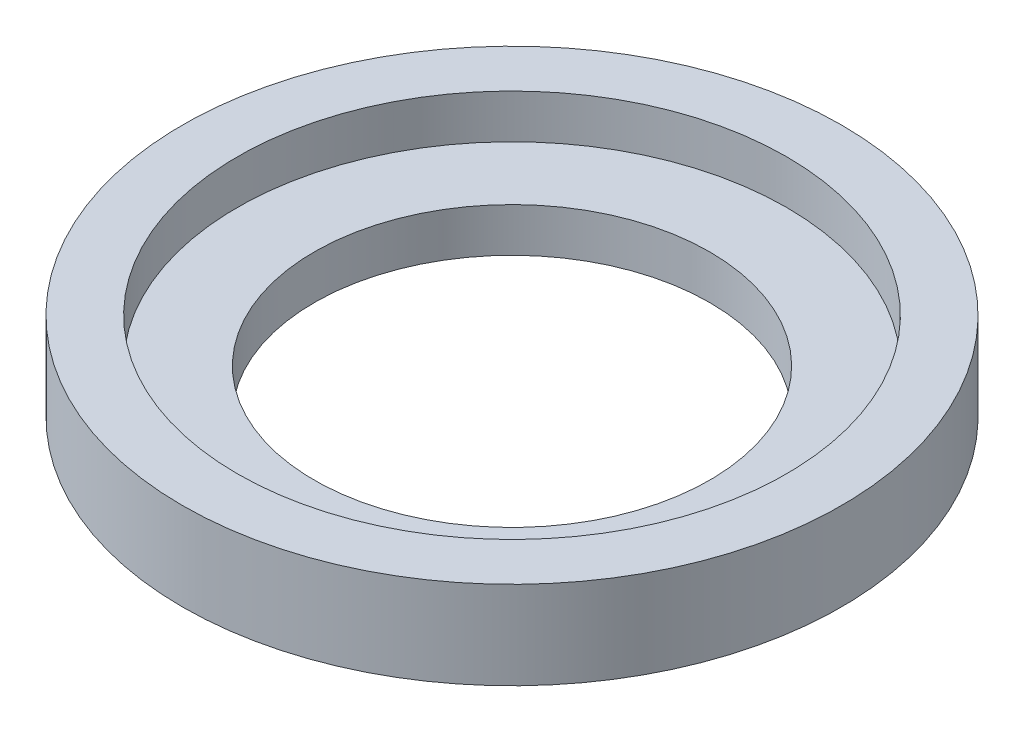
ISO-10303-21;
HEADER;
FILE_DESCRIPTION(('STEP AP214'),'2;1');
FILE_NAME('part.step','',(''),(''),'','','');
FILE_SCHEMA(('AUTOMOTIVE_DESIGN { 1 0 10303 214 1 1 1 1 }'));
ENDSEC;
DATA;
#1=APPLICATION_CONTEXT('core data for automotive mechanical design processes');
#2=APPLICATION_PROTOCOL_DEFINITION('international standard','automotive_design',2000,#1);
#3=PRODUCT_CONTEXT('',#1,'mechanical');
#4=PRODUCT('Part','Part','',(#3));
#5=PRODUCT_RELATED_PRODUCT_CATEGORY('part','',(#4));
#6=PRODUCT_DEFINITION_FORMATION('','',#4);
#7=PRODUCT_DEFINITION_CONTEXT('part definition',#1,'design');
#8=PRODUCT_DEFINITION('design','',#6,#7);
#9=PRODUCT_DEFINITION_SHAPE('','',#8);
#10=(LENGTH_UNIT() NAMED_UNIT(*) SI_UNIT(.MILLI.,.METRE.));
#11=(NAMED_UNIT(*) PLANE_ANGLE_UNIT() SI_UNIT($,.RADIAN.));
#12=(NAMED_UNIT(*) SI_UNIT($,.STERADIAN.) SOLID_ANGLE_UNIT());
#13=UNCERTAINTY_MEASURE_WITH_UNIT(LENGTH_MEASURE(1.E-05),#10,'distance_accuracy_value','');
#14=(GEOMETRIC_REPRESENTATION_CONTEXT(3) GLOBAL_UNCERTAINTY_ASSIGNED_CONTEXT((#13)) GLOBAL_UNIT_ASSIGNED_CONTEXT((#10,
#11,#12)) REPRESENTATION_CONTEXT('',''));
#15=CARTESIAN_POINT('',(0.,0.,0.));
#16=DIRECTION('',(0.,0.,1.));
#17=DIRECTION('',(1.,0.,0.));
#18=AXIS2_PLACEMENT_3D('',#15,#16,#17);
#19=CARTESIAN_POINT('',(15.,0.,0.));
#20=DIRECTION('',(0.,-1.,0.));
#21=DIRECTION('',(0.,0.,-1.));
#22=AXIS2_PLACEMENT_3D('',#19,#20,#21);
#23=PLANE('',#22);
#24=CARTESIAN_POINT('',(0.,0.,0.));
#25=DIRECTION('',(0.,-1.,0.));
#26=DIRECTION('',(0.,0.,-1.));
#27=AXIS2_PLACEMENT_3D('',#24,#25,#26);
#28=CIRCLE('',#27,15.);
#29=CARTESIAN_POINT('',(0.,0.,-15.));
#30=VERTEX_POINT('',#29);
#31=EDGE_CURVE('E64',#30,#30,#28,.T.);
#32=ORIENTED_EDGE('',*,*,#31,.T.);
#33=EDGE_LOOP('',(#32));
#34=FACE_BOUND('',#33,.T.);
#35=CARTESIAN_POINT('',(0.,0.,0.));
#36=DIRECTION('',(0.,-1.,0.));
#37=DIRECTION('',(0.,0.,-1.));
#38=AXIS2_PLACEMENT_3D('',#35,#36,#37);
#39=CIRCLE('',#38,9.);
#40=CARTESIAN_POINT('',(0.,0.,-9.));
#41=VERTEX_POINT('',#40);
#42=EDGE_CURVE('E10',#41,#41,#39,.T.);
#43=ORIENTED_EDGE('',*,*,#42,.F.);
#44=EDGE_LOOP('',(#43));
#45=FACE_BOUND('',#44,.T.);
#46=ADVANCED_FACE('F37',(#34,#45),#23,.T.);
#47=CARTESIAN_POINT('',(0.,0.,0.));
#48=DIRECTION('',(0.,-1.,0.));
#49=DIRECTION('',(0.,0.,-1.));
#50=AXIS2_PLACEMENT_3D('',#47,#48,#49);
#51=CYLINDRICAL_SURFACE('',#50,9.);
#52=ORIENTED_EDGE('',*,*,#42,.T.);
#53=EDGE_LOOP('',(#52));
#54=FACE_BOUND('',#53,.T.);
#55=CARTESIAN_POINT('',(0.,2.,0.));
#56=DIRECTION('',(0.,-1.,0.));
#57=DIRECTION('',(0.,0.,-1.));
#58=AXIS2_PLACEMENT_3D('',#55,#56,#57);
#59=CIRCLE('',#58,9.);
#60=CARTESIAN_POINT('',(0.,2.,-9.));
#61=VERTEX_POINT('',#60);
#62=EDGE_CURVE('E44',#61,#61,#59,.T.);
#63=ORIENTED_EDGE('',*,*,#62,.F.);
#64=EDGE_LOOP('',(#63));
#65=FACE_BOUND('',#64,.T.);
#66=ADVANCED_FACE('F83',(#54,#65),#51,.F.);
#67=CARTESIAN_POINT('',(9.,2.,0.));
#68=DIRECTION('',(0.,1.,0.));
#69=DIRECTION('',(0.,0.,1.));
#70=AXIS2_PLACEMENT_3D('',#67,#68,#69);
#71=PLANE('',#70);
#72=ORIENTED_EDGE('',*,*,#62,.T.);
#73=EDGE_LOOP('',(#72));
#74=FACE_BOUND('',#73,.T.);
#75=CARTESIAN_POINT('',(0.,2.,0.));
#76=DIRECTION('',(0.,-1.,0.));
#77=DIRECTION('',(0.,0.,-1.));
#78=AXIS2_PLACEMENT_3D('',#75,#76,#77);
#79=CIRCLE('',#78,12.5);
#80=CARTESIAN_POINT('',(0.,2.,-12.5));
#81=VERTEX_POINT('',#80);
#82=EDGE_CURVE('E49',#81,#81,#79,.T.);
#83=ORIENTED_EDGE('',*,*,#82,.F.);
#84=EDGE_LOOP('',(#83));
#85=FACE_BOUND('',#84,.T.);
#86=ADVANCED_FACE('F87',(#74,#85),#71,.T.);
#87=CARTESIAN_POINT('',(0.,0.,0.));
#88=DIRECTION('',(0.,-1.,0.));
#89=DIRECTION('',(0.,0.,-1.));
#90=AXIS2_PLACEMENT_3D('',#87,#88,#89);
#91=CYLINDRICAL_SURFACE('',#90,12.5);
#92=ORIENTED_EDGE('',*,*,#82,.T.);
#93=EDGE_LOOP('',(#92));
#94=FACE_BOUND('',#93,.T.);
#95=CARTESIAN_POINT('',(0.,4.,0.));
#96=DIRECTION('',(0.,-1.,0.));
#97=DIRECTION('',(0.,0.,-1.));
#98=AXIS2_PLACEMENT_3D('',#95,#96,#97);
#99=CIRCLE('',#98,12.5);
#100=CARTESIAN_POINT('',(0.,4.,-12.5));
#101=VERTEX_POINT('',#100);
#102=EDGE_CURVE('E54',#101,#101,#99,.T.);
#103=ORIENTED_EDGE('',*,*,#102,.F.);
#104=EDGE_LOOP('',(#103));
#105=FACE_BOUND('',#104,.T.);
#106=ADVANCED_FACE('F79',(#94,#105),#91,.F.);
#107=CARTESIAN_POINT('',(12.5,4.,0.));
#108=DIRECTION('',(0.,1.,0.));
#109=DIRECTION('',(0.,0.,1.));
#110=AXIS2_PLACEMENT_3D('',#107,#108,#109);
#111=PLANE('',#110);
#112=ORIENTED_EDGE('',*,*,#102,.T.);
#113=EDGE_LOOP('',(#112));
#114=FACE_BOUND('',#113,.T.);
#115=CARTESIAN_POINT('',(0.,4.,0.));
#116=DIRECTION('',(0.,-1.,0.));
#117=DIRECTION('',(0.,0.,-1.));
#118=AXIS2_PLACEMENT_3D('',#115,#116,#117);
#119=CIRCLE('',#118,15.);
#120=CARTESIAN_POINT('',(0.,4.,-15.));
#121=VERTEX_POINT('',#120);
#122=EDGE_CURVE('E60',#121,#121,#119,.T.);
#123=ORIENTED_EDGE('',*,*,#122,.F.);
#124=EDGE_LOOP('',(#123));
#125=FACE_BOUND('',#124,.T.);
#126=ADVANCED_FACE('F73',(#114,#125),#111,.T.);
#127=CARTESIAN_POINT('',(0.,0.,0.));
#128=DIRECTION('',(0.,-1.,0.));
#129=DIRECTION('',(0.,0.,-1.));
#130=AXIS2_PLACEMENT_3D('',#127,#128,#129);
#131=CYLINDRICAL_SURFACE('',#130,15.);
#132=ORIENTED_EDGE('',*,*,#122,.T.);
#133=EDGE_LOOP('',(#132));
#134=FACE_BOUND('',#133,.T.);
#135=ORIENTED_EDGE('',*,*,#31,.F.);
#136=EDGE_LOOP('',(#135));
#137=FACE_BOUND('',#136,.T.);
#138=ADVANCED_FACE('F71',(#134,#137),#131,.T.);
#139=CLOSED_SHELL('',(#46,#66,#86,#106,#126,#138));
#140=MANIFOLD_SOLID_BREP('B2',#139);
#141=ADVANCED_BREP_SHAPE_REPRESENTATION('',(#18,#140),#14);
#142=SHAPE_DEFINITION_REPRESENTATION(#9,#141);
ENDSEC;
END-ISO-10303-21;
